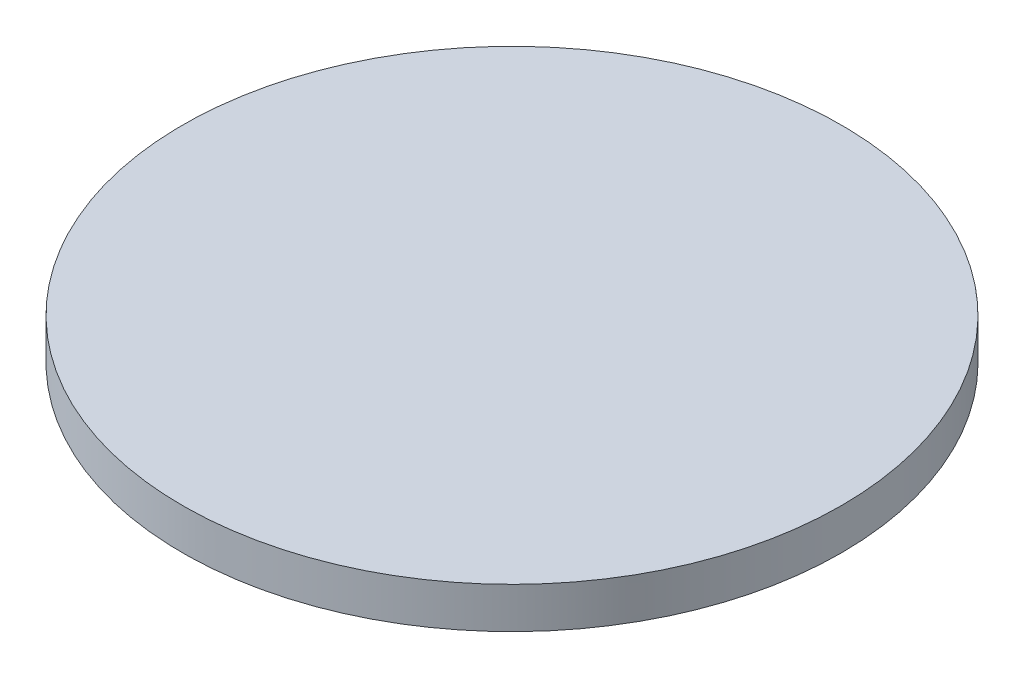
ISO-10303-21;
HEADER;
FILE_DESCRIPTION(('STEP AP214'),'2;1');
FILE_NAME('part.step','',(''),(''),'','','');
FILE_SCHEMA(('AUTOMOTIVE_DESIGN { 1 0 10303 214 1 1 1 1 }'));
ENDSEC;
DATA;
#1=APPLICATION_CONTEXT('core data for automotive mechanical design processes');
#2=APPLICATION_PROTOCOL_DEFINITION('international standard','automotive_design',2000,#1);
#3=PRODUCT_CONTEXT('',#1,'mechanical');
#4=PRODUCT('Part','Part','',(#3));
#5=PRODUCT_RELATED_PRODUCT_CATEGORY('part','',(#4));
#6=PRODUCT_DEFINITION_FORMATION('','',#4);
#7=PRODUCT_DEFINITION_CONTEXT('part definition',#1,'design');
#8=PRODUCT_DEFINITION('design','',#6,#7);
#9=PRODUCT_DEFINITION_SHAPE('','',#8);
#10=(LENGTH_UNIT() NAMED_UNIT(*) SI_UNIT(.MILLI.,.METRE.));
#11=(NAMED_UNIT(*) PLANE_ANGLE_UNIT() SI_UNIT($,.RADIAN.));
#12=(NAMED_UNIT(*) SI_UNIT($,.STERADIAN.) SOLID_ANGLE_UNIT());
#13=UNCERTAINTY_MEASURE_WITH_UNIT(LENGTH_MEASURE(1.E-05),#10,'distance_accuracy_value','');
#14=(GEOMETRIC_REPRESENTATION_CONTEXT(3) GLOBAL_UNCERTAINTY_ASSIGNED_CONTEXT((#13)) GLOBAL_UNIT_ASSIGNED_CONTEXT((#10,
#11,#12)) REPRESENTATION_CONTEXT('',''));
#15=CARTESIAN_POINT('',(0.,0.,0.));
#16=DIRECTION('',(0.,0.,1.));
#17=DIRECTION('',(1.,0.,0.));
#18=AXIS2_PLACEMENT_3D('',#15,#16,#17);
#19=CARTESIAN_POINT('',(35.1668890293275,-2024.78447114177,-0.000163139255021432));
#20=CARTESIAN_POINT('',(35.1668890293275,-2024.78447114177,-2.65855316857933));
#21=CARTESIAN_POINT('',(34.9056923741289,-2024.78447114177,-7.97533322722799));
#22=CARTESIAN_POINT('',(33.7340806255968,-2024.78447114177,-15.8736980675823));
#23=CARTESIAN_POINT('',(31.7939353729369,-2024.78447114177,-23.61919208922));
#24=CARTESIAN_POINT('',(29.1039412755235,-2024.78447114177,-31.1372219505949));
#25=CARTESIAN_POINT('',(25.6900044470151,-2024.78447114177,-38.3553849143689));
#26=CARTESIAN_POINT('',(21.5850029653179,-2024.78447114177,-45.2041661253515));
#27=CARTESIAN_POINT('',(16.8284702387229,-2024.78447114177,-51.6176080765564));
#28=CARTESIAN_POINT('',(11.4662142775723,-2024.78447114177,-57.5339458160493));
#29=CARTESIAN_POINT('',(5.54987653807932,-2024.78447114177,-62.8962017771999));
#30=CARTESIAN_POINT('',(-0.863565413125526,-2024.78447114177,-67.652734503795));
#31=CARTESIAN_POINT('',(-7.71234662410815,-2024.78447114177,-71.7577359854921));
#32=CARTESIAN_POINT('',(-14.9305095878821,-2024.78447114177,-75.1716728140005));
#33=CARTESIAN_POINT('',(-22.4485394492571,-2024.78447114177,-77.8616669114139));
#34=CARTESIAN_POINT('',(-30.1940334708947,-2024.78447114177,-79.8018121640739));
#35=CARTESIAN_POINT('',(-38.0923983112491,-2024.78447114177,-80.973423912606));
#36=CARTESIAN_POINT('',(-46.067568399222,-2024.78447114177,-81.3652188954038));
#37=CARTESIAN_POINT('',(-54.042738487195,-2024.78447114177,-80.973423912606));
#38=CARTESIAN_POINT('',(-61.9411033275493,-2024.78447114177,-79.8018121640739));
#39=CARTESIAN_POINT('',(-69.686597349187,-2024.78447114177,-77.8616669114139));
#40=CARTESIAN_POINT('',(-77.2046272105619,-2024.78447114177,-75.1716728140005));
#41=CARTESIAN_POINT('',(-84.4227901743359,-2024.78447114177,-71.7577359854922));
#42=CARTESIAN_POINT('',(-91.2715713853185,-2024.78447114177,-67.652734503795));
#43=CARTESIAN_POINT('',(-97.6850133365233,-2024.78447114177,-62.8962017772));
#44=CARTESIAN_POINT('',(-103.601351076016,-2024.78447114177,-57.5339458160494));
#45=CARTESIAN_POINT('',(-108.963607037167,-2024.78447114177,-51.6176080765564));
#46=CARTESIAN_POINT('',(-113.720139763762,-2024.78447114177,-45.2041661253515));
#47=CARTESIAN_POINT('',(-117.825141245459,-2024.78447114177,-38.3553849143689));
#48=CARTESIAN_POINT('',(-121.239078073968,-2024.78447114177,-31.1372219505949));
#49=CARTESIAN_POINT('',(-123.929072171381,-2024.78447114177,-23.61919208922));
#50=CARTESIAN_POINT('',(-125.869217424041,-2024.78447114177,-15.8736980675823));
#51=CARTESIAN_POINT('',(-127.040829172573,-2024.78447114177,-7.97533322722799));
#52=CARTESIAN_POINT('',(-127.432624155371,-2024.78447114177,-0.000163139255013215));
#53=CARTESIAN_POINT('',(-127.040829172573,-2024.78447114177,7.97500694871788));
#54=CARTESIAN_POINT('',(-125.869217424041,-2024.78447114177,15.8733717890723));
#55=CARTESIAN_POINT('',(-123.929072171381,-2024.78447114177,23.6188658107099));
#56=CARTESIAN_POINT('',(-121.239078073968,-2024.78447114177,31.1368956720849));
#57=CARTESIAN_POINT('',(-117.825141245459,-2024.78447114177,38.3550586358588));
#58=CARTESIAN_POINT('',(-113.720139763762,-2024.78447114177,45.2038398468415));
#59=CARTESIAN_POINT('',(-108.963607037167,-2024.78447114177,51.6172817980463));
#60=CARTESIAN_POINT('',(-103.601351076016,-2024.78447114177,57.5336195375393));
#61=CARTESIAN_POINT('',(-97.6850133365234,-2024.78447114177,62.8958754986899));
#62=CARTESIAN_POINT('',(-91.2715713853185,-2024.78447114177,67.652408225285));
#63=CARTESIAN_POINT('',(-84.422790174336,-2024.78447114177,71.757409706982));
#64=CARTESIAN_POINT('',(-77.204627210562,-2024.78447114177,75.1713465354905));
#65=CARTESIAN_POINT('',(-69.6865973491871,-2024.78447114177,77.8613406329038));
#66=CARTESIAN_POINT('',(-61.9411033275493,-2024.78447114177,79.8014858855638));
#67=CARTESIAN_POINT('',(-54.042738487195,-2024.78447114177,80.9730976340959));
#68=CARTESIAN_POINT('',(-46.0675683992221,-2024.78447114177,81.3648926168938));
#69=CARTESIAN_POINT('',(-38.092398311249,-2024.78447114177,80.9730976340959));
#70=CARTESIAN_POINT('',(-30.1940334708948,-2024.78447114177,79.8014858855639));
#71=CARTESIAN_POINT('',(-22.448539449257,-2024.78447114177,77.8613406329038));
#72=CARTESIAN_POINT('',(-14.9305095878821,-2024.78447114177,75.1713465354905));
#73=CARTESIAN_POINT('',(-7.71234662410811,-2024.78447114177,71.7574097069821));
#74=CARTESIAN_POINT('',(-0.863565413125604,-2024.78447114177,67.652408225285));
#75=CARTESIAN_POINT('',(5.54987653807932,-2024.78447114177,62.8958754986899));
#76=CARTESIAN_POINT('',(11.4662142775723,-2024.78447114177,57.5336195375394));
#77=CARTESIAN_POINT('',(16.8284702387229,-2024.78447114177,51.6172817980463));
#78=CARTESIAN_POINT('',(21.5850029653179,-2024.78447114177,45.2038398468415));
#79=CARTESIAN_POINT('',(25.6900044470151,-2024.78447114177,38.3550586358588));
#80=CARTESIAN_POINT('',(29.1039412755234,-2024.78447114177,31.136895672085));
#81=CARTESIAN_POINT('',(31.7939353729369,-2024.78447114177,23.61886581071));
#82=CARTESIAN_POINT('',(33.7340806255968,-2024.78447114177,15.8733717890723));
#83=CARTESIAN_POINT('',(34.9056923741289,-2024.78447114177,7.97500694871791));
#84=CARTESIAN_POINT('',(35.1668890293275,-2024.78447114177,2.6582268900693));
#85=CARTESIAN_POINT('',(35.1668890293275,-2024.78447114177,-0.000163139255021432));
#86=B_SPLINE_CURVE_WITH_KNOTS('',3,(#19,#20,#21,#22,#23,#24,#25,#26,#27,#28,#29,#30,#31,#32,#33,
#34,#35,#36,#37,#38,#39,#40,#41,#42,#43,#44,#45,#46,#47,#48,#49,#50,#51,#52,#53,#54,#55,#56,#57,
#58,#59,#60,#61,#62,#63,#64,#65,#66,#67,#68,#69,#70,#71,#72,#73,#74,#75,#76,#77,#78,#79,#80,#81,
#82,#83,#84,#85),.UNSPECIFIED.,.T.,.F.,(4,1,1,1,1,1,1,1,1,1,1,1,1,1,1,1,1,1,1,1,1,1,1,1,1,1,1,1,
1,1,1,1,1,1,1,1,1,1,1,1,1,1,1,1,1,1,1,1,1,1,1,1,1,1,1,1,1,1,1,1,1,1,1,1,4),(0.,0.015625,0.03125,
0.046875,0.0625,0.078125,0.09375,0.109375,0.125,0.140625,0.15625,0.171875,0.1875,0.203125,
0.21875,0.234375,0.25,0.265625,0.28125,0.296875,0.3125,0.328125,0.34375,0.359375,0.375,0.390625,
0.40625,0.421875,0.4375,0.453125,0.46875,0.484375,0.5,0.515625,0.53125,0.546875,0.5625,0.578125,
0.59375,0.609375,0.625,0.640625,0.65625,0.671875,0.6875,0.703125,0.71875,0.734375,0.75,0.765625,
0.78125,0.796875,0.8125,0.828125,0.84375,0.859375,0.875,0.890625,0.90625,0.921875,0.9375,
0.953125,0.96875,0.984375,1.),.UNSPECIFIED.);
#87=DIRECTION('',(0.,-1.,0.));
#88=VECTOR('',#87,1.);
#89=SURFACE_OF_LINEAR_EXTRUSION('',#86,#88);
#90=CARTESIAN_POINT('',(35.1668890293275,-2024.78447114177,-0.000163139255021432));
#91=CARTESIAN_POINT('',(35.1668890293275,-2024.78447114177,1.32903187540713));
#92=CARTESIAN_POINT('',(35.1342394474276,-2024.78447114177,2.65822689006928));
#93=CARTESIAN_POINT('',(35.0037983364893,-2024.78447114177,5.3134167007428));
#94=CARTESIAN_POINT('',(34.9060068074507,-2024.78447114177,6.63941149675417));
#95=CARTESIAN_POINT('',(34.6454390188957,-2024.78447114177,9.28500065147537));
#96=CARTESIAN_POINT('',(34.4826627593793,-2024.78447114177,10.6045950101852));
#97=CARTESIAN_POINT('',(34.0925956457689,-2024.78447114177,13.2342138915076));
#98=CARTESIAN_POINT('',(33.8653047916749,-2024.78447114177,14.5442384141201));
#99=CARTESIAN_POINT('',(33.3466786248095,-2024.78447114177,17.1515482244521));
#100=CARTESIAN_POINT('',(33.0553433120382,-2024.78447114177,18.4488335121716));
#101=CARTESIAN_POINT('',(32.4094067552921,-2024.78447114177,21.0275567968197));
#102=CARTESIAN_POINT('',(32.0548055113174,-2024.78447114177,22.3089947937484));
#103=CARTESIAN_POINT('',(31.2831156196386,-2024.78447114177,24.8529154409171));
#104=CARTESIAN_POINT('',(30.8660269719344,-2024.78447114177,26.1153980911572));
#105=CARTESIAN_POINT('',(29.970441694199,-2024.78447114177,28.6183912642265));
#106=CARTESIAN_POINT('',(29.4919450641678,-2024.78447114177,29.8589017870556));
#107=CARTESIAN_POINT('',(28.4746232431809,-2024.78447114177,32.3149339245804));
#108=CARTESIAN_POINT('',(27.9357980522251,-2024.78447114177,33.5304555392761));
#109=CARTESIAN_POINT('',(26.7991890293017,-2024.78447114177,35.9336134082345));
#110=CARTESIAN_POINT('',(26.2014051973341,-2024.78447114177,37.1212496624972));
#111=CARTESIAN_POINT('',(24.9482488122999,-2024.78447114177,39.4657403582899));
#112=CARTESIAN_POINT('',(24.2928762592332,-2024.78447114177,40.62259479982));
#113=CARTESIAN_POINT('',(22.9261896573463,-2024.78447114177,42.9027736406898));
#114=CARTESIAN_POINT('',(22.214875608526,-2024.78447114177,44.0260980400295));
#115=CARTESIAN_POINT('',(20.7379532404773,-2024.78447114177,46.2364685670607));
#116=CARTESIAN_POINT('',(19.9723449212489,-2024.78447114177,47.3235146947523));
#117=CARTESIAN_POINT('',(18.3887426794815,-2024.78447114177,49.4587551388233));
#118=CARTESIAN_POINT('',(17.5707487569425,-2024.78447114177,50.5069494552028));
#119=CARTESIAN_POINT('',(15.8842839756516,-2024.78447114177,52.5619127369858));
#120=CARTESIAN_POINT('',(15.0158131168996,-2024.78447114177,53.5686817023893));
#121=CARTESIAN_POINT('',(13.2305461905249,-2024.78447114177,55.538420216944));
#122=CARTESIAN_POINT('',(12.3137501229022,-2024.78447114177,56.5013897660952));
#123=CARTESIAN_POINT('',(10.4339845061283,-2024.78447114177,58.3811553828692));
#124=CARTESIAN_POINT('',(9.47101495697707,-2024.78447114177,59.2979514504919));
#125=CARTESIAN_POINT('',(7.50127644242235,-2024.78447114177,61.0832183768665));
#126=CARTESIAN_POINT('',(6.49450747701886,-2024.78447114177,61.9516892356185));
#127=CARTESIAN_POINT('',(4.43954419523589,-2024.78447114177,63.6381540169094));
#128=CARTESIAN_POINT('',(3.3913498788564,-2024.78447114177,64.4561479394484));
#129=CARTESIAN_POINT('',(1.25610943478537,-2024.78447114177,66.0397501812158));
#130=CARTESIAN_POINT('',(0.169063307093816,-2024.78447114177,66.8053585004443));
#131=CARTESIAN_POINT('',(-2.04130721993742,-2024.78447114177,68.282280868493));
#132=CARTESIAN_POINT('',(-3.16463161927712,-2024.78447114177,68.9935949173133));
#133=CARTESIAN_POINT('',(-5.44481046014688,-2024.78447114177,70.3602815192002));
#134=CARTESIAN_POINT('',(-6.60166490167695,-2024.78447114177,71.0156540722668));
#135=CARTESIAN_POINT('',(-8.94615559746972,-2024.78447114177,72.2688104573011));
#136=CARTESIAN_POINT('',(-10.1337918517324,-2024.78447114177,72.8665942892687));
#137=CARTESIAN_POINT('',(-12.5369497206908,-2024.78447114177,74.003203312192));
#138=CARTESIAN_POINT('',(-13.7524713353865,-2024.78447114177,74.5420285031478));
#139=CARTESIAN_POINT('',(-16.2085034729113,-2024.78447114177,75.5593503241348));
#140=CARTESIAN_POINT('',(-17.4490139957404,-2024.78447114177,76.037846954166));
#141=CARTESIAN_POINT('',(-19.9520071688096,-2024.78447114177,76.9334322319013));
#142=CARTESIAN_POINT('',(-21.2144898190497,-2024.78447114177,77.3505208796055));
#143=CARTESIAN_POINT('',(-23.7584104662185,-2024.78447114177,78.1222107712844));
#144=CARTESIAN_POINT('',(-25.0398484631472,-2024.78447114177,78.4768120152591));
#145=CARTESIAN_POINT('',(-27.6185717477953,-2024.78447114177,79.1227485720052));
#146=CARTESIAN_POINT('',(-28.9158570355148,-2024.78447114177,79.4140838847765));
#147=CARTESIAN_POINT('',(-31.5231668458468,-2024.78447114177,79.9327100516419));
#148=CARTESIAN_POINT('',(-32.8331913684594,-2024.78447114177,80.1600009057359));
#149=CARTESIAN_POINT('',(-35.4628102497817,-2024.78447114177,80.5500680193463));
#150=CARTESIAN_POINT('',(-36.7824046084915,-2024.78447114177,80.7128442788627));
#151=CARTESIAN_POINT('',(-39.4279937632128,-2024.78447114177,80.9734120674177));
#152=CARTESIAN_POINT('',(-40.7539885592242,-2024.78447114177,81.0712035964563));
#153=CARTESIAN_POINT('',(-43.4091783698977,-2024.78447114177,81.2016447073946));
#154=CARTESIAN_POINT('',(-44.7383733845599,-2024.78447114177,81.2342942892945));
#155=CARTESIAN_POINT('',(-47.3967634138842,-2024.78447114177,81.2342942892945));
#156=CARTESIAN_POINT('',(-48.7259584285464,-2024.78447114177,81.2016447073947));
#157=CARTESIAN_POINT('',(-51.3811482392199,-2024.78447114177,81.0712035964563));
#158=CARTESIAN_POINT('',(-52.7071430352313,-2024.78447114177,80.9734120674177));
#159=CARTESIAN_POINT('',(-55.3527321899525,-2024.78447114177,80.7128442788627));
#160=CARTESIAN_POINT('',(-56.6723265486623,-2024.78447114177,80.5500680193463));
#161=CARTESIAN_POINT('',(-59.3019454299847,-2024.78447114177,80.1600009057359));
#162=CARTESIAN_POINT('',(-60.6119699525972,-2024.78447114177,79.9327100516419));
#163=CARTESIAN_POINT('',(-63.2192797629292,-2024.78447114177,79.4140838847765));
#164=CARTESIAN_POINT('',(-64.5165650506487,-2024.78447114177,79.1227485720052));
#165=CARTESIAN_POINT('',(-67.0952883352968,-2024.78447114177,78.4768120152591));
#166=CARTESIAN_POINT('',(-68.3767263322255,-2024.78447114177,78.1222107712844));
#167=CARTESIAN_POINT('',(-70.9206469793942,-2024.78447114177,77.3505208796055));
#168=CARTESIAN_POINT('',(-72.1831296296344,-2024.78447114177,76.9334322319013));
#169=CARTESIAN_POINT('',(-74.6861228027036,-2024.78447114177,76.037846954166));
#170=CARTESIAN_POINT('',(-75.9266333255327,-2024.78447114177,75.5593503241348));
#171=CARTESIAN_POINT('',(-78.3826654630575,-2024.78447114177,74.5420285031478));
#172=CARTESIAN_POINT('',(-79.5981870777532,-2024.78447114177,74.0032033121921));
#173=CARTESIAN_POINT('',(-82.0013449467116,-2024.78447114177,72.8665942892687));
#174=CARTESIAN_POINT('',(-83.1889812009743,-2024.78447114177,72.2688104573011));
#175=CARTESIAN_POINT('',(-85.5334718967671,-2024.78447114177,71.0156540722668));
#176=CARTESIAN_POINT('',(-86.6903263382972,-2024.78447114177,70.3602815192002));
#177=CARTESIAN_POINT('',(-88.9705051791669,-2024.78447114177,68.9935949173132));
#178=CARTESIAN_POINT('',(-90.0938295785066,-2024.78447114177,68.282280868493));
#179=CARTESIAN_POINT('',(-92.3042001055378,-2024.78447114177,66.8053585004443));
#180=CARTESIAN_POINT('',(-93.3912462332294,-2024.78447114177,66.0397501812159));
#181=CARTESIAN_POINT('',(-95.5264866773004,-2024.78447114177,64.4561479394484));
#182=CARTESIAN_POINT('',(-96.5746809936799,-2024.78447114177,63.6381540169094));
#183=CARTESIAN_POINT('',(-98.6296442754629,-2024.78447114177,61.9516892356185));
#184=CARTESIAN_POINT('',(-99.6364132408664,-2024.78447114177,61.0832183768665));
#185=CARTESIAN_POINT('',(-101.606151755421,-2024.78447114177,59.2979514504919));
#186=CARTESIAN_POINT('',(-102.569121304572,-2024.78447114177,58.3811553828692));
#187=CARTESIAN_POINT('',(-104.448886921346,-2024.78447114177,56.5013897660953));
#188=CARTESIAN_POINT('',(-105.365682988969,-2024.78447114177,55.538420216944));
#189=CARTESIAN_POINT('',(-107.150949915344,-2024.78447114177,53.5686817023893));
#190=CARTESIAN_POINT('',(-108.019420774096,-2024.78447114177,52.5619127369858));
#191=CARTESIAN_POINT('',(-109.705885555387,-2024.78447114177,50.5069494552028));
#192=CARTESIAN_POINT('',(-110.523879477925,-2024.78447114177,49.4587551388234));
#193=CARTESIAN_POINT('',(-112.107481719693,-2024.78447114177,47.3235146947524));
#194=CARTESIAN_POINT('',(-112.873090038921,-2024.78447114177,46.2364685670608));
#195=CARTESIAN_POINT('',(-114.35001240697,-2024.78447114177,44.0260980400296));
#196=CARTESIAN_POINT('',(-115.06132645579,-2024.78447114177,42.9027736406899));
#197=CARTESIAN_POINT('',(-116.428013057677,-2024.78447114177,40.6225947998201));
#198=CARTESIAN_POINT('',(-117.083385610744,-2024.78447114177,39.46574035829));
#199=CARTESIAN_POINT('',(-118.336541995778,-2024.78447114177,37.1212496624973));
#200=CARTESIAN_POINT('',(-118.934325827746,-2024.78447114177,35.9336134082346));
#201=CARTESIAN_POINT('',(-120.070934850669,-2024.78447114177,33.5304555392762));
#202=CARTESIAN_POINT('',(-120.609760041625,-2024.78447114177,32.3149339245805));
#203=CARTESIAN_POINT('',(-121.627081862612,-2024.78447114177,29.8589017870557));
#204=CARTESIAN_POINT('',(-122.105578492643,-2024.78447114177,28.6183912642266));
#205=CARTESIAN_POINT('',(-123.001163770378,-2024.78447114177,26.1153980911574));
#206=CARTESIAN_POINT('',(-123.418252418083,-2024.78447114177,24.8529154409173));
#207=CARTESIAN_POINT('',(-124.189942309761,-2024.78447114177,22.3089947937485));
#208=CARTESIAN_POINT('',(-124.544543553736,-2024.78447114177,21.0275567968198));
#209=CARTESIAN_POINT('',(-125.190480110482,-2024.78447114177,18.4488335121717));
#210=CARTESIAN_POINT('',(-125.481815423254,-2024.78447114177,17.1515482244522));
#211=CARTESIAN_POINT('',(-126.000441590119,-2024.78447114177,14.5442384141202));
#212=CARTESIAN_POINT('',(-126.227732444213,-2024.78447114177,13.2342138915077));
#213=CARTESIAN_POINT('',(-126.617799557823,-2024.78447114177,10.6045950101853));
#214=CARTESIAN_POINT('',(-126.78057581734,-2024.78447114177,9.28500065147549));
#215=CARTESIAN_POINT('',(-127.041143605895,-2024.78447114177,6.63941149675428));
#216=CARTESIAN_POINT('',(-127.138935134933,-2024.78447114177,5.3134167007429));
#217=CARTESIAN_POINT('',(-127.269376245872,-2024.78447114177,2.65822689006938));
#218=CARTESIAN_POINT('',(-127.302025827772,-2024.78447114177,1.32903187540723));
#219=CARTESIAN_POINT('',(-127.302025827772,-2024.78447114177,-1.32935815391708));
#220=CARTESIAN_POINT('',(-127.269376245872,-2024.78447114177,-2.65855316857923));
#221=CARTESIAN_POINT('',(-127.138935134933,-2024.78447114177,-5.31374297925277));
#222=CARTESIAN_POINT('',(-127.041143605895,-2024.78447114177,-6.63973777526415));
#223=CARTESIAN_POINT('',(-126.78057581734,-2024.78447114177,-9.28532692998536));
#224=CARTESIAN_POINT('',(-126.617799557823,-2024.78447114177,-10.6049212886952));
#225=CARTESIAN_POINT('',(-126.227732444213,-2024.78447114177,-13.2345401700176));
#226=CARTESIAN_POINT('',(-126.000441590119,-2024.78447114177,-14.5445646926301));
#227=CARTESIAN_POINT('',(-125.481815423254,-2024.78447114177,-17.1518745029621));
#228=CARTESIAN_POINT('',(-125.190480110482,-2024.78447114177,-18.4491597906816));
#229=CARTESIAN_POINT('',(-124.544543553736,-2024.78447114177,-21.0278830753297));
#230=CARTESIAN_POINT('',(-124.189942309761,-2024.78447114177,-22.3093210722584));
#231=CARTESIAN_POINT('',(-123.418252418083,-2024.78447114177,-24.8532417194272));
#232=CARTESIAN_POINT('',(-123.001163770378,-2024.78447114177,-26.1157243696673));
#233=CARTESIAN_POINT('',(-122.105578492643,-2024.78447114177,-28.6187175427365));
#234=CARTESIAN_POINT('',(-121.627081862612,-2024.78447114177,-29.8592280655656));
#235=CARTESIAN_POINT('',(-120.609760041625,-2024.78447114177,-32.3152602030904));
#236=CARTESIAN_POINT('',(-120.070934850669,-2024.78447114177,-33.5307818177861));
#237=CARTESIAN_POINT('',(-118.934325827746,-2024.78447114177,-35.9339396867445));
#238=CARTESIAN_POINT('',(-118.336541995778,-2024.78447114177,-37.1215759410072));
#239=CARTESIAN_POINT('',(-117.083385610744,-2024.78447114177,-39.4660666368));
#240=CARTESIAN_POINT('',(-116.428013057677,-2024.78447114177,-40.6229210783301));
#241=CARTESIAN_POINT('',(-115.06132645579,-2024.78447114177,-42.9030999191998));
#242=CARTESIAN_POINT('',(-114.35001240697,-2024.78447114177,-44.0264243185395));
#243=CARTESIAN_POINT('',(-112.873090038921,-2024.78447114177,-46.2367948455708));
#244=CARTESIAN_POINT('',(-112.107481719693,-2024.78447114177,-47.3238409732623));
#245=CARTESIAN_POINT('',(-110.523879477926,-2024.78447114177,-49.4590814173333));
#246=CARTESIAN_POINT('',(-109.705885555387,-2024.78447114177,-50.5072757337128));
#247=CARTESIAN_POINT('',(-108.019420774096,-2024.78447114177,-52.5622390154958));
#248=CARTESIAN_POINT('',(-107.150949915344,-2024.78447114177,-53.5690079808993));
#249=CARTESIAN_POINT('',(-105.365682988969,-2024.78447114177,-55.538746495454));
#250=CARTESIAN_POINT('',(-104.448886921346,-2024.78447114177,-56.5017160446053));
#251=CARTESIAN_POINT('',(-102.569121304572,-2024.78447114177,-58.3814816613792));
#252=CARTESIAN_POINT('',(-101.606151755421,-2024.78447114177,-59.2982777290019));
#253=CARTESIAN_POINT('',(-99.6364132408664,-2024.78447114177,-61.0835446553765));
#254=CARTESIAN_POINT('',(-98.6296442754629,-2024.78447114177,-61.9520155141285));
#255=CARTESIAN_POINT('',(-96.57468099368,-2024.78447114177,-63.6384802954194));
#256=CARTESIAN_POINT('',(-95.5264866773005,-2024.78447114177,-64.4564742179584));
#257=CARTESIAN_POINT('',(-93.3912462332295,-2024.78447114177,-66.0400764597258));
#258=CARTESIAN_POINT('',(-92.3042001055379,-2024.78447114177,-66.8056847789543));
#259=CARTESIAN_POINT('',(-90.0938295785067,-2024.78447114177,-68.282607147003));
#260=CARTESIAN_POINT('',(-88.970505179167,-2024.78447114177,-68.9939211958232));
#261=CARTESIAN_POINT('',(-86.6903263382973,-2024.78447114177,-70.3606077977102));
#262=CARTESIAN_POINT('',(-85.5334718967672,-2024.78447114177,-71.0159803507769));
#263=CARTESIAN_POINT('',(-83.1889812009744,-2024.78447114177,-72.2691367358111));
#264=CARTESIAN_POINT('',(-82.0013449467117,-2024.78447114177,-72.8669205677787));
#265=CARTESIAN_POINT('',(-79.5981870777533,-2024.78447114177,-74.0035295907021));
#266=CARTESIAN_POINT('',(-78.3826654630576,-2024.78447114177,-74.5423547816578));
#267=CARTESIAN_POINT('',(-75.9266333255328,-2024.78447114177,-75.5596766026448));
#268=CARTESIAN_POINT('',(-74.6861228027037,-2024.78447114177,-76.038173232676));
#269=CARTESIAN_POINT('',(-72.1831296296344,-2024.78447114177,-76.9337585104113));
#270=CARTESIAN_POINT('',(-70.9206469793943,-2024.78447114177,-77.3508471581155));
#271=CARTESIAN_POINT('',(-68.3767263322255,-2024.78447114177,-78.1225370497944));
#272=CARTESIAN_POINT('',(-67.0952883352969,-2024.78447114177,-78.4771382937691));
#273=CARTESIAN_POINT('',(-64.5165650506487,-2024.78447114177,-79.1230748505152));
#274=CARTESIAN_POINT('',(-63.2192797629293,-2024.78447114177,-79.4144101632865));
#275=CARTESIAN_POINT('',(-60.6119699525973,-2024.78447114177,-79.9330363301519));
#276=CARTESIAN_POINT('',(-59.3019454299847,-2024.78447114177,-80.1603271842459));
#277=CARTESIAN_POINT('',(-56.6723265486624,-2024.78447114177,-80.5503942978563));
#278=CARTESIAN_POINT('',(-55.3527321899525,-2024.78447114177,-80.7131705573728));
#279=CARTESIAN_POINT('',(-52.7071430352313,-2024.78447114177,-80.9737383459278));
#280=CARTESIAN_POINT('',(-51.3811482392199,-2024.78447114177,-81.0715298749663));
#281=CARTESIAN_POINT('',(-48.7259584285464,-2024.78447114177,-81.2019709859047));
#282=CARTESIAN_POINT('',(-47.3967634138842,-2024.78447114177,-81.2346205678045));
#283=CARTESIAN_POINT('',(-44.7383733845599,-2024.78447114177,-81.2346205678045));
#284=CARTESIAN_POINT('',(-43.4091783698978,-2024.78447114177,-81.2019709859047));
#285=CARTESIAN_POINT('',(-40.7539885592242,-2024.78447114177,-81.0715298749663));
#286=CARTESIAN_POINT('',(-39.4279937632128,-2024.78447114177,-80.9737383459278));
#287=CARTESIAN_POINT('',(-36.7824046084916,-2024.78447114177,-80.7131705573728));
#288=CARTESIAN_POINT('',(-35.4628102497818,-2024.78447114177,-80.5503942978564));
#289=CARTESIAN_POINT('',(-32.8331913684594,-2024.78447114177,-80.1603271842459));
#290=CARTESIAN_POINT('',(-31.5231668458469,-2024.78447114177,-79.9330363301519));
#291=CARTESIAN_POINT('',(-28.9158570355149,-2024.78447114177,-79.4144101632866));
#292=CARTESIAN_POINT('',(-27.6185717477954,-2024.78447114177,-79.1230748505152));
#293=CARTESIAN_POINT('',(-25.0398484631473,-2024.78447114177,-78.4771382937692));
#294=CARTESIAN_POINT('',(-23.7584104662186,-2024.78447114177,-78.1225370497944));
#295=CARTESIAN_POINT('',(-21.2144898190498,-2024.78447114177,-77.3508471581156));
#296=CARTESIAN_POINT('',(-19.9520071688097,-2024.78447114177,-76.9337585104114));
#297=CARTESIAN_POINT('',(-17.4490139957405,-2024.78447114177,-76.038173232676));
#298=CARTESIAN_POINT('',(-16.2085034729114,-2024.78447114177,-75.5596766026448));
#299=CARTESIAN_POINT('',(-13.7524713353866,-2024.78447114177,-74.5423547816579));
#300=CARTESIAN_POINT('',(-12.5369497206908,-2024.78447114177,-74.0035295907021));
#301=CARTESIAN_POINT('',(-10.1337918517325,-2024.78447114177,-72.8669205677788));
#302=CARTESIAN_POINT('',(-8.94615559746977,-2024.78447114177,-72.2691367358112));
#303=CARTESIAN_POINT('',(-6.60166490167701,-2024.78447114177,-71.0159803507769));
#304=CARTESIAN_POINT('',(-5.44481046014694,-2024.78447114177,-70.3606077977102));
#305=CARTESIAN_POINT('',(-3.16463161927717,-2024.78447114177,-68.9939211958233));
#306=CARTESIAN_POINT('',(-2.04130721993747,-2024.78447114177,-68.2826071470031));
#307=CARTESIAN_POINT('',(0.16906330709378,-2024.78447114177,-66.8056847789544));
#308=CARTESIAN_POINT('',(1.25610943478533,-2024.78447114177,-66.0400764597259));
#309=CARTESIAN_POINT('',(3.39134987885635,-2024.78447114177,-64.4564742179585));
#310=CARTESIAN_POINT('',(4.43954419523584,-2024.78447114177,-63.6384802954195));
#311=CARTESIAN_POINT('',(6.49450747701881,-2024.78447114177,-61.9520155141286));
#312=CARTESIAN_POINT('',(7.5012764424223,-2024.78447114177,-61.0835446553766));
#313=CARTESIAN_POINT('',(9.47101495697703,-2024.78447114177,-59.298277729002));
#314=CARTESIAN_POINT('',(10.4339845061283,-2024.78447114177,-58.3814816613793));
#315=CARTESIAN_POINT('',(12.3137501229022,-2024.78447114177,-56.5017160446053));
#316=CARTESIAN_POINT('',(13.2305461905249,-2024.78447114177,-55.5387464954541));
#317=CARTESIAN_POINT('',(15.0158131168996,-2024.78447114177,-53.5690079808994));
#318=CARTESIAN_POINT('',(15.8842839756515,-2024.78447114177,-52.5622390154959));
#319=CARTESIAN_POINT('',(17.5707487569424,-2024.78447114177,-50.5072757337129));
#320=CARTESIAN_POINT('',(18.3887426794814,-2024.78447114177,-49.4590814173334));
#321=CARTESIAN_POINT('',(19.9723449212488,-2024.78447114177,-47.3238409732624));
#322=CARTESIAN_POINT('',(20.7379532404773,-2024.78447114177,-46.2367948455708));
#323=CARTESIAN_POINT('',(22.214875608526,-2024.78447114177,-44.0264243185396));
#324=CARTESIAN_POINT('',(22.9261896573462,-2024.78447114177,-42.9030999191999));
#325=CARTESIAN_POINT('',(24.2928762592332,-2024.78447114177,-40.6229210783301));
#326=CARTESIAN_POINT('',(24.9482488122998,-2024.78447114177,-39.4660666368001));
#327=CARTESIAN_POINT('',(26.2014051973341,-2024.78447114177,-37.1215759410073));
#328=CARTESIAN_POINT('',(26.7991890293017,-2024.78447114177,-35.9339396867446));
#329=CARTESIAN_POINT('',(27.935798052225,-2024.78447114177,-33.5307818177862));
#330=CARTESIAN_POINT('',(28.4746232431808,-2024.78447114177,-32.3152602030905));
#331=CARTESIAN_POINT('',(29.4919450641678,-2024.78447114177,-29.8592280655657));
#332=CARTESIAN_POINT('',(29.970441694199,-2024.78447114177,-28.6187175427366));
#333=CARTESIAN_POINT('',(30.8660269719343,-2024.78447114177,-26.1157243696674));
#334=CARTESIAN_POINT('',(31.2831156196385,-2024.78447114177,-24.8532417194273));
#335=CARTESIAN_POINT('',(32.0548055113174,-2024.78447114177,-22.3093210722585));
#336=CARTESIAN_POINT('',(32.4094067552921,-2024.78447114177,-21.0278830753298));
#337=CARTESIAN_POINT('',(33.0553433120382,-2024.78447114177,-18.4491597906817));
#338=CARTESIAN_POINT('',(33.3466786248095,-2024.78447114177,-17.1518745029622));
#339=CARTESIAN_POINT('',(33.8653047916749,-2024.78447114177,-14.5445646926302));
#340=CARTESIAN_POINT('',(34.0925956457689,-2024.78447114177,-13.2345401700177));
#341=CARTESIAN_POINT('',(34.4826627593793,-2024.78447114177,-10.6049212886953));
#342=CARTESIAN_POINT('',(34.6454390188957,-2024.78447114177,-9.28532692998548));
#343=CARTESIAN_POINT('',(34.9060068074507,-2024.78447114177,-6.63973777526427));
#344=CARTESIAN_POINT('',(35.0037983364893,-2024.78447114177,-5.31374297925288));
#345=CARTESIAN_POINT('',(35.1342394474276,-2024.78447114177,-2.65855316857934));
#346=CARTESIAN_POINT('',(35.1668890293275,-2024.78447114177,-1.32935815391718));
#347=CARTESIAN_POINT('',(35.1668890293275,-2024.78447114177,-0.000163139255021432));
#348=B_SPLINE_CURVE_WITH_KNOTS('',3,(#90,#91,#92,#93,#94,#95,#96,#97,#98,#99,#100,#101,#102,
#103,#104,#105,#106,#107,#108,#109,#110,#111,#112,#113,#114,#115,#116,#117,#118,#119,#120,#121,
#122,#123,#124,#125,#126,#127,#128,#129,#130,#131,#132,#133,#134,#135,#136,#137,#138,#139,#140,
#141,#142,#143,#144,#145,#146,#147,#148,#149,#150,#151,#152,#153,#154,#155,#156,#157,#158,#159,
#160,#161,#162,#163,#164,#165,#166,#167,#168,#169,#170,#171,#172,#173,#174,#175,#176,#177,#178,
#179,#180,#181,#182,#183,#184,#185,#186,#187,#188,#189,#190,#191,#192,#193,#194,#195,#196,#197,
#198,#199,#200,#201,#202,#203,#204,#205,#206,#207,#208,#209,#210,#211,#212,#213,#214,#215,#216,
#217,#218,#219,#220,#221,#222,#223,#224,#225,#226,#227,#228,#229,#230,#231,#232,#233,#234,#235,
#236,#237,#238,#239,#240,#241,#242,#243,#244,#245,#246,#247,#248,#249,#250,#251,#252,#253,#254,
#255,#256,#257,#258,#259,#260,#261,#262,#263,#264,#265,#266,#267,#268,#269,#270,#271,#272,#273,
#274,#275,#276,#277,#278,#279,#280,#281,#282,#283,#284,#285,#286,#287,#288,#289,#290,#291,#292,
#293,#294,#295,#296,#297,#298,#299,#300,#301,#302,#303,#304,#305,#306,#307,#308,#309,#310,#311,
#312,#313,#314,#315,#316,#317,#318,#319,#320,#321,#322,#323,#324,#325,#326,#327,#328,#329,#330,
#331,#332,#333,#334,#335,#336,#337,#338,#339,#340,#341,#342,#343,#344,#345,#346,#347),
.UNSPECIFIED.,.F.,.F.,(4,2,2,2,2,2,2,2,2,2,2,2,2,2,2,2,2,2,2,2,2,2,2,2,2,2,2,2,2,2,2,2,2,2,2,2,
2,2,2,2,2,2,2,2,2,2,2,2,2,2,2,2,2,2,2,2,2,2,2,2,2,2,2,2,2,2,2,2,2,2,2,2,2,2,2,2,2,2,2,2,2,2,2,2,
2,2,2,2,2,2,2,2,2,2,2,2,2,2,2,2,2,2,2,2,2,2,2,2,2,2,2,2,2,2,2,2,2,2,2,2,2,2,2,2,2,2,2,2,4),(0.,
3.9871862839769,7.97437256795381,11.9615588519307,15.9487451359077,19.9359314198846,
23.9231177038615,27.9103039878385,31.8974902718154,35.8846765557923,39.8718628397693,
43.8590491237462,47.8462354077232,51.8334216917001,55.820607975677,59.807794259654,
63.7949805436309,67.7821668276079,71.7693531115848,75.7565393955617,79.7437256795387,
83.7309119635156,87.7180982474925,91.7052845314695,95.6924708154464,99.6796570994234,
103.6668433834,107.654029667377,111.641215951354,115.628402235331,119.615588519308,
123.602774803285,127.589961087262,131.577147371239,135.564333655216,139.551519939193,
143.53870622317,147.525892507147,151.513078791124,155.5002650751,159.487451359077,
163.474637643054,167.461823927031,171.449010211008,175.436196494985,179.423382778962,
183.410569062939,187.397755346916,191.384941630893,195.37212791487,199.359314198847,
203.346500482824,207.333686766801,211.320873050778,215.308059334754,219.295245618731,
223.282431902708,227.269618186685,231.256804470662,235.243990754639,239.231177038616,
243.218363322593,247.20554960657,251.192735890547,255.179922174524,259.167108458501,
263.154294742478,267.141481026455,271.128667310432,275.115853594408,279.103039878385,
283.090226162362,287.077412446339,291.064598730316,295.051785014293,299.03897129827,
303.026157582247,307.013343866224,311.000530150201,314.987716434178,318.974902718155,
322.962089002132,326.949275286109,330.936461570085,334.923647854062,338.910834138039,
342.898020422016,346.885206705993,350.87239298997,354.859579273947,358.846765557924,
362.833951841901,366.821138125878,370.808324409855,374.795510693832,378.782696977809,
382.769883261786,386.757069545763,390.744255829739,394.731442113716,398.718628397693,
402.70581468167,406.693000965647,410.680187249624,414.667373533601,418.654559817578,
422.641746101555,426.628932385532,430.616118669509,434.603304953486,438.590491237463,
442.57767752144,446.564863805417,450.552050089393,454.53923637337,458.526422657347,
462.513608941324,466.500795225301,470.487981509278,474.475167793255,478.462354077232,
482.449540361209,486.436726645186,490.423912929163,494.41109921314,498.398285497117,
502.385471781093,506.37265806507,510.359844349047),.UNSPECIFIED.);
#349=CARTESIAN_POINT('',(35.1668890293275,-2024.78447114177,-0.000163139255021432));
#350=VERTEX_POINT('',#349);
#351=EDGE_CURVE('E9',#350,#350,#348,.F.);
#352=ORIENTED_EDGE('',*,*,#351,.F.);
#353=EDGE_LOOP('',(#352));
#354=FACE_BOUND('',#353,.T.);
#355=CARTESIAN_POINT('',(35.1668890293275,-2034.88419158621,-0.000163139255021432));
#356=CARTESIAN_POINT('',(35.1668890293275,-2034.88419158621,-2.65855316857933));
#357=CARTESIAN_POINT('',(34.9056923741289,-2034.88419158621,-7.97533322722799));
#358=CARTESIAN_POINT('',(33.7340806255968,-2034.88419158621,-15.8736980675823));
#359=CARTESIAN_POINT('',(31.7939353729369,-2034.88419158621,-23.61919208922));
#360=CARTESIAN_POINT('',(29.1039412755235,-2034.88419158621,-31.1372219505949));
#361=CARTESIAN_POINT('',(25.6900044470151,-2034.88419158621,-38.3553849143689));
#362=CARTESIAN_POINT('',(21.5850029653179,-2034.88419158621,-45.2041661253515));
#363=CARTESIAN_POINT('',(16.8284702387229,-2034.88419158621,-51.6176080765564));
#364=CARTESIAN_POINT('',(11.4662142775723,-2034.88419158621,-57.5339458160493));
#365=CARTESIAN_POINT('',(5.54987653807932,-2034.88419158621,-62.8962017771999));
#366=CARTESIAN_POINT('',(-0.863565413125527,-2034.88419158621,-67.652734503795));
#367=CARTESIAN_POINT('',(-7.71234662410815,-2034.88419158621,-71.7577359854921));
#368=CARTESIAN_POINT('',(-14.9305095878821,-2034.88419158621,-75.1716728140005));
#369=CARTESIAN_POINT('',(-22.4485394492571,-2034.88419158621,-77.8616669114139));
#370=CARTESIAN_POINT('',(-30.1940334708947,-2034.88419158621,-79.8018121640739));
#371=CARTESIAN_POINT('',(-38.0923983112491,-2034.88419158621,-80.973423912606));
#372=CARTESIAN_POINT('',(-46.067568399222,-2034.88419158621,-81.3652188954038));
#373=CARTESIAN_POINT('',(-54.042738487195,-2034.88419158621,-80.973423912606));
#374=CARTESIAN_POINT('',(-61.9411033275493,-2034.88419158621,-79.8018121640739));
#375=CARTESIAN_POINT('',(-69.686597349187,-2034.88419158621,-77.8616669114139));
#376=CARTESIAN_POINT('',(-77.2046272105619,-2034.88419158621,-75.1716728140005));
#377=CARTESIAN_POINT('',(-84.4227901743359,-2034.88419158621,-71.7577359854922));
#378=CARTESIAN_POINT('',(-91.2715713853185,-2034.88419158621,-67.652734503795));
#379=CARTESIAN_POINT('',(-97.6850133365233,-2034.88419158621,-62.8962017772));
#380=CARTESIAN_POINT('',(-103.601351076016,-2034.88419158621,-57.5339458160494));
#381=CARTESIAN_POINT('',(-108.963607037167,-2034.88419158621,-51.6176080765564));
#382=CARTESIAN_POINT('',(-113.720139763762,-2034.88419158621,-45.2041661253515));
#383=CARTESIAN_POINT('',(-117.825141245459,-2034.88419158621,-38.3553849143689));
#384=CARTESIAN_POINT('',(-121.239078073968,-2034.88419158621,-31.1372219505949));
#385=CARTESIAN_POINT('',(-123.929072171381,-2034.88419158621,-23.61919208922));
#386=CARTESIAN_POINT('',(-125.869217424041,-2034.88419158621,-15.8736980675823));
#387=CARTESIAN_POINT('',(-127.040829172573,-2034.88419158621,-7.97533322722799));
#388=CARTESIAN_POINT('',(-127.432624155371,-2034.88419158621,-0.000163139255013215));
#389=CARTESIAN_POINT('',(-127.040829172573,-2034.88419158621,7.97500694871788));
#390=CARTESIAN_POINT('',(-125.869217424041,-2034.88419158621,15.8733717890723));
#391=CARTESIAN_POINT('',(-123.929072171381,-2034.88419158621,23.6188658107099));
#392=CARTESIAN_POINT('',(-121.239078073968,-2034.88419158621,31.1368956720849));
#393=CARTESIAN_POINT('',(-117.825141245459,-2034.88419158621,38.3550586358588));
#394=CARTESIAN_POINT('',(-113.720139763762,-2034.88419158621,45.2038398468415));
#395=CARTESIAN_POINT('',(-108.963607037167,-2034.88419158621,51.6172817980463));
#396=CARTESIAN_POINT('',(-103.601351076016,-2034.88419158621,57.5336195375393));
#397=CARTESIAN_POINT('',(-97.6850133365234,-2034.88419158621,62.8958754986899));
#398=CARTESIAN_POINT('',(-91.2715713853185,-2034.88419158621,67.652408225285));
#399=CARTESIAN_POINT('',(-84.422790174336,-2034.88419158621,71.757409706982));
#400=CARTESIAN_POINT('',(-77.204627210562,-2034.88419158621,75.1713465354905));
#401=CARTESIAN_POINT('',(-69.6865973491871,-2034.88419158621,77.8613406329038));
#402=CARTESIAN_POINT('',(-61.9411033275493,-2034.88419158621,79.8014858855638));
#403=CARTESIAN_POINT('',(-54.042738487195,-2034.88419158621,80.9730976340959));
#404=CARTESIAN_POINT('',(-46.0675683992221,-2034.88419158621,81.3648926168938));
#405=CARTESIAN_POINT('',(-38.092398311249,-2034.88419158621,80.9730976340959));
#406=CARTESIAN_POINT('',(-30.1940334708948,-2034.88419158621,79.8014858855639));
#407=CARTESIAN_POINT('',(-22.448539449257,-2034.88419158621,77.8613406329038));
#408=CARTESIAN_POINT('',(-14.9305095878821,-2034.88419158621,75.1713465354905));
#409=CARTESIAN_POINT('',(-7.71234662410811,-2034.88419158621,71.7574097069821));
#410=CARTESIAN_POINT('',(-0.863565413125604,-2034.88419158621,67.652408225285));
#411=CARTESIAN_POINT('',(5.54987653807932,-2034.88419158621,62.8958754986899));
#412=CARTESIAN_POINT('',(11.4662142775723,-2034.88419158621,57.5336195375394));
#413=CARTESIAN_POINT('',(16.8284702387229,-2034.88419158621,51.6172817980463));
#414=CARTESIAN_POINT('',(21.5850029653179,-2034.88419158621,45.2038398468415));
#415=CARTESIAN_POINT('',(25.6900044470151,-2034.88419158621,38.3550586358588));
#416=CARTESIAN_POINT('',(29.1039412755234,-2034.88419158621,31.136895672085));
#417=CARTESIAN_POINT('',(31.7939353729369,-2034.88419158621,23.61886581071));
#418=CARTESIAN_POINT('',(33.7340806255968,-2034.88419158621,15.8733717890723));
#419=CARTESIAN_POINT('',(34.9056923741289,-2034.88419158621,7.97500694871791));
#420=CARTESIAN_POINT('',(35.1668890293275,-2034.88419158621,2.6582268900693));
#421=CARTESIAN_POINT('',(35.1668890293275,-2034.88419158621,-0.000163139255023818));
#422=B_SPLINE_CURVE_WITH_KNOTS('',3,(#355,#356,#357,#358,#359,#360,#361,#362,#363,#364,#365,
#366,#367,#368,#369,#370,#371,#372,#373,#374,#375,#376,#377,#378,#379,#380,#381,#382,#383,#384,
#385,#386,#387,#388,#389,#390,#391,#392,#393,#394,#395,#396,#397,#398,#399,#400,#401,#402,#403,
#404,#405,#406,#407,#408,#409,#410,#411,#412,#413,#414,#415,#416,#417,#418,#419,#420,#421),
.UNSPECIFIED.,.T.,.F.,(4,1,1,1,1,1,1,1,1,1,1,1,1,1,1,1,1,1,1,1,1,1,1,1,1,1,1,1,1,1,1,1,1,1,1,1,
1,1,1,1,1,1,1,1,1,1,1,1,1,1,1,1,1,1,1,1,1,1,1,1,1,1,1,1,4),(0.,0.015625,0.03125,0.046875,0.0625,
0.078125,0.09375,0.109375,0.125,0.140625,0.15625,0.171875,0.1875,0.203125,0.21875,0.234375,0.25,
0.265625,0.28125,0.296875,0.3125,0.328125,0.34375,0.359375,0.375,0.390625,0.40625,0.421875,
0.4375,0.453125,0.46875,0.484375,0.5,0.515625,0.53125,0.546875,0.5625,0.578125,0.59375,0.609375,
0.625,0.640625,0.65625,0.671875,0.6875,0.703125,0.71875,0.734375,0.75,0.765625,0.78125,0.796875,
0.8125,0.828125,0.84375,0.859375,0.875,0.890625,0.90625,0.921875,0.9375,0.953125,0.96875,
0.984375,1.),.UNSPECIFIED.);
#423=CARTESIAN_POINT('',(35.1668890293275,-2034.88419158621,-0.000163139255021432));
#424=VERTEX_POINT('',#423);
#425=EDGE_CURVE('E24',#424,#424,#422,.T.);
#426=ORIENTED_EDGE('',*,*,#425,.T.);
#427=EDGE_LOOP('',(#426));
#428=FACE_BOUND('',#427,.T.);
#429=ADVANCED_FACE('F14',(#354,#428),#89,.F.);
#430=CARTESIAN_POINT('',(-46.067568399222,-2024.78447114177,78.999836860745));
#431=DIRECTION('',(0.,-1.,0.));
#432=DIRECTION('',(1.,0.,0.));
#433=AXIS2_PLACEMENT_3D('',#430,#431,#432);
#434=PLANE('',#433);
#435=ORIENTED_EDGE('',*,*,#351,.T.);
#436=EDGE_LOOP('',(#435));
#437=FACE_BOUND('',#436,.T.);
#438=ADVANCED_FACE('F59',(#437),#434,.F.);
#439=CARTESIAN_POINT('',(-46.067568399222,-2034.88419158621,78.999836860745));
#440=DIRECTION('',(0.,-1.,0.));
#441=DIRECTION('',(1.,0.,0.));
#442=AXIS2_PLACEMENT_3D('',#439,#440,#441);
#443=PLANE('',#442);
#444=ORIENTED_EDGE('',*,*,#425,.F.);
#445=EDGE_LOOP('',(#444));
#446=FACE_BOUND('',#445,.T.);
#447=ADVANCED_FACE('F67',(#446),#443,.T.);
#448=CLOSED_SHELL('',(#429,#438,#447));
#449=MANIFOLD_SOLID_BREP('B1',#448);
#450=ADVANCED_BREP_SHAPE_REPRESENTATION('',(#18,#449),#14);
#451=SHAPE_DEFINITION_REPRESENTATION(#9,#450);
ENDSEC;
END-ISO-10303-21;
